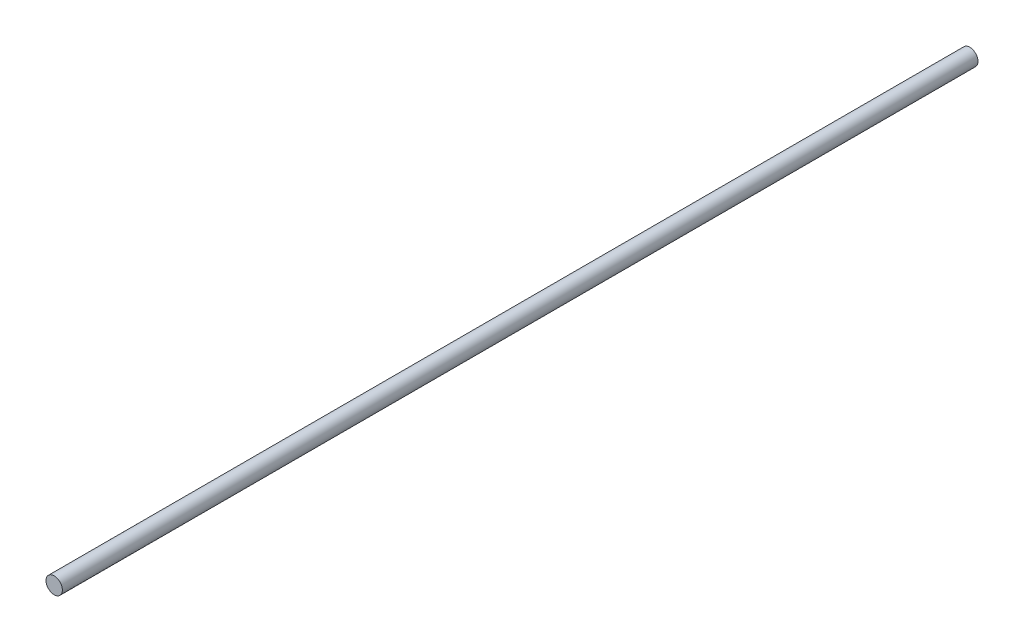
ISO-10303-21;
HEADER;
FILE_DESCRIPTION(('STEP AP214'),'2;1');
FILE_NAME('part.step','',(''),(''),'','','');
FILE_SCHEMA(('AUTOMOTIVE_DESIGN { 1 0 10303 214 1 1 1 1 }'));
ENDSEC;
DATA;
#1=APPLICATION_CONTEXT('core data for automotive mechanical design processes');
#2=APPLICATION_PROTOCOL_DEFINITION('international standard','automotive_design',2000,#1);
#3=PRODUCT_CONTEXT('',#1,'mechanical');
#4=PRODUCT('Part','Part','',(#3));
#5=PRODUCT_RELATED_PRODUCT_CATEGORY('part','',(#4));
#6=PRODUCT_DEFINITION_FORMATION('','',#4);
#7=PRODUCT_DEFINITION_CONTEXT('part definition',#1,'design');
#8=PRODUCT_DEFINITION('design','',#6,#7);
#9=PRODUCT_DEFINITION_SHAPE('','',#8);
#10=(LENGTH_UNIT() NAMED_UNIT(*) SI_UNIT(.MILLI.,.METRE.));
#11=(NAMED_UNIT(*) PLANE_ANGLE_UNIT() SI_UNIT($,.RADIAN.));
#12=(NAMED_UNIT(*) SI_UNIT($,.STERADIAN.) SOLID_ANGLE_UNIT());
#13=UNCERTAINTY_MEASURE_WITH_UNIT(LENGTH_MEASURE(1.E-05),#10,'distance_accuracy_value','');
#14=(GEOMETRIC_REPRESENTATION_CONTEXT(3) GLOBAL_UNCERTAINTY_ASSIGNED_CONTEXT((#13)) GLOBAL_UNIT_ASSIGNED_CONTEXT((#10,
#11,#12)) REPRESENTATION_CONTEXT('',''));
#15=CARTESIAN_POINT('',(0.,0.,0.));
#16=DIRECTION('',(0.,0.,1.));
#17=DIRECTION('',(1.,0.,0.));
#18=AXIS2_PLACEMENT_3D('',#15,#16,#17);
#19=CARTESIAN_POINT('',(0.,0.,530.));
#20=DIRECTION('',(0.,0.,-1.));
#21=DIRECTION('',(-1.,0.,0.));
#22=AXIS2_PLACEMENT_3D('',#19,#20,#21);
#23=CYLINDRICAL_SURFACE('',#22,4.75);
#24=CARTESIAN_POINT('',(0.,0.,530.));
#25=DIRECTION('',(0.,0.,1.));
#26=DIRECTION('',(1.,0.,0.));
#27=AXIS2_PLACEMENT_3D('',#24,#25,#26);
#28=CIRCLE('',#27,4.75);
#29=CARTESIAN_POINT('',(4.75,0.,530.));
#30=VERTEX_POINT('',#29);
#31=EDGE_CURVE('E10',#30,#30,#28,.T.);
#32=ORIENTED_EDGE('',*,*,#31,.F.);
#33=EDGE_LOOP('',(#32));
#34=FACE_BOUND('',#33,.T.);
#35=CARTESIAN_POINT('',(0.,0.,0.));
#36=DIRECTION('',(0.,0.,1.));
#37=DIRECTION('',(1.,0.,0.));
#38=AXIS2_PLACEMENT_3D('',#35,#36,#37);
#39=CIRCLE('',#38,4.75);
#40=CARTESIAN_POINT('',(4.75,0.,0.));
#41=VERTEX_POINT('',#40);
#42=EDGE_CURVE('E36',#41,#41,#39,.T.);
#43=ORIENTED_EDGE('',*,*,#42,.T.);
#44=EDGE_LOOP('',(#43));
#45=FACE_BOUND('',#44,.T.);
#46=ADVANCED_FACE('F33',(#34,#45),#23,.T.);
#47=CARTESIAN_POINT('',(0.,0.,530.));
#48=DIRECTION('',(0.,0.,1.));
#49=DIRECTION('',(1.,0.,0.));
#50=AXIS2_PLACEMENT_3D('',#47,#48,#49);
#51=PLANE('',#50);
#52=ORIENTED_EDGE('',*,*,#31,.T.);
#53=EDGE_LOOP('',(#52));
#54=FACE_BOUND('',#53,.T.);
#55=ADVANCED_FACE('F48',(#54),#51,.T.);
#56=CARTESIAN_POINT('',(0.,0.,0.));
#57=DIRECTION('',(0.,0.,1.));
#58=DIRECTION('',(1.,0.,0.));
#59=AXIS2_PLACEMENT_3D('',#56,#57,#58);
#60=PLANE('',#59);
#61=ORIENTED_EDGE('',*,*,#42,.F.);
#62=EDGE_LOOP('',(#61));
#63=FACE_BOUND('',#62,.T.);
#64=ADVANCED_FACE('F46',(#63),#60,.F.);
#65=CLOSED_SHELL('',(#46,#55,#64));
#66=MANIFOLD_SOLID_BREP('B2',#65);
#67=ADVANCED_BREP_SHAPE_REPRESENTATION('',(#18,#66),#14);
#68=SHAPE_DEFINITION_REPRESENTATION(#9,#67);
ENDSEC;
END-ISO-10303-21;
